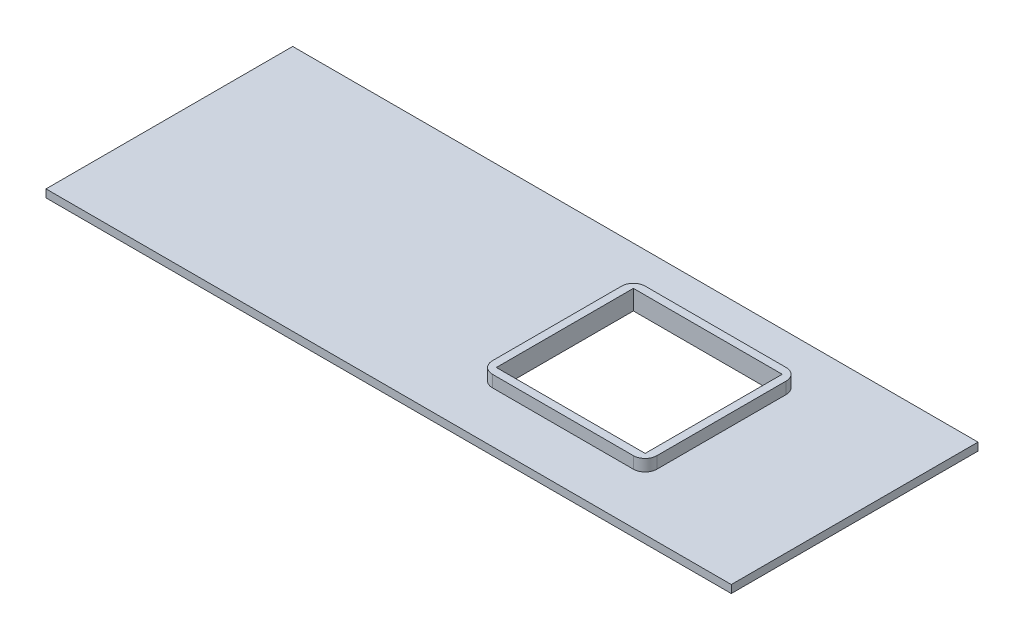
ISO-10303-21;
HEADER;
FILE_DESCRIPTION(('STEP AP214'),'2;1');
FILE_NAME('part.step','',(''),(''),'','','');
FILE_SCHEMA(('AUTOMOTIVE_DESIGN { 1 0 10303 214 1 1 1 1 }'));
ENDSEC;
DATA;
#1=APPLICATION_CONTEXT('core data for automotive mechanical design processes');
#2=APPLICATION_PROTOCOL_DEFINITION('international standard','automotive_design',2000,#1);
#3=PRODUCT_CONTEXT('',#1,'mechanical');
#4=PRODUCT('Part','Part','',(#3));
#5=PRODUCT_RELATED_PRODUCT_CATEGORY('part','',(#4));
#6=PRODUCT_DEFINITION_FORMATION('','',#4);
#7=PRODUCT_DEFINITION_CONTEXT('part definition',#1,'design');
#8=PRODUCT_DEFINITION('design','',#6,#7);
#9=PRODUCT_DEFINITION_SHAPE('','',#8);
#10=(LENGTH_UNIT() NAMED_UNIT(*) SI_UNIT(.MILLI.,.METRE.));
#11=(NAMED_UNIT(*) PLANE_ANGLE_UNIT() SI_UNIT($,.RADIAN.));
#12=(NAMED_UNIT(*) SI_UNIT($,.STERADIAN.) SOLID_ANGLE_UNIT());
#13=UNCERTAINTY_MEASURE_WITH_UNIT(LENGTH_MEASURE(1.E-05),#10,'distance_accuracy_value','');
#14=(GEOMETRIC_REPRESENTATION_CONTEXT(3) GLOBAL_UNCERTAINTY_ASSIGNED_CONTEXT((#13)) GLOBAL_UNIT_ASSIGNED_CONTEXT((#10,
#11,#12)) REPRESENTATION_CONTEXT('',''));
#15=CARTESIAN_POINT('',(0.,0.,0.));
#16=DIRECTION('',(0.,0.,1.));
#17=DIRECTION('',(1.,0.,0.));
#18=AXIS2_PLACEMENT_3D('',#15,#16,#17);
#19=CARTESIAN_POINT('',(0.,3.,0.));
#20=DIRECTION('',(0.,1.,0.));
#21=DIRECTION('',(0.,0.,1.));
#22=AXIS2_PLACEMENT_3D('',#19,#20,#21);
#23=PLANE('',#22);
#24=DIRECTION('',(-1.,0.,0.));
#25=VECTOR('',#24,1.);
#26=CARTESIAN_POINT('',(-39.3895207019308,3.,-29.1848180567591));
#27=LINE('',#26,#25);
#28=CARTESIAN_POINT('',(-0.389520701930782,3.,-29.1848180567591));
#29=VERTEX_POINT('',#28);
#30=CARTESIAN_POINT('',(-36.3895207019308,3.,-29.1848180567591));
#31=VERTEX_POINT('',#30);
#32=EDGE_CURVE('E266',#29,#31,#27,.T.);
#33=ORIENTED_EDGE('',*,*,#32,.T.);
#34=CARTESIAN_POINT('',(-36.3895207019308,3.,-26.1848180567591));
#35=DIRECTION('',(0.,1.,0.));
#36=DIRECTION('',(0.,0.,1.));
#37=AXIS2_PLACEMENT_3D('',#34,#35,#36);
#38=CIRCLE('',#37,3.);
#39=CARTESIAN_POINT('',(-39.3895207019308,3.,-26.1848180567591));
#40=VERTEX_POINT('',#39);
#41=EDGE_CURVE('E319',#31,#40,#38,.T.);
#42=ORIENTED_EDGE('',*,*,#41,.T.);
#43=DIRECTION('',(0.,0.,1.));
#44=VECTOR('',#43,1.);
#45=CARTESIAN_POINT('',(-39.3895207019308,3.,-29.1848180567591));
#46=LINE('',#45,#44);
#47=CARTESIAN_POINT('',(-39.3895207019308,3.,6.81518194324093));
#48=VERTEX_POINT('',#47);
#49=EDGE_CURVE('E255',#40,#48,#46,.T.);
#50=ORIENTED_EDGE('',*,*,#49,.T.);
#51=CARTESIAN_POINT('',(-36.3895207019308,3.,6.81518194324093));
#52=DIRECTION('',(0.,1.,0.));
#53=DIRECTION('',(0.,0.,1.));
#54=AXIS2_PLACEMENT_3D('',#51,#52,#53);
#55=CIRCLE('',#54,3.);
#56=CARTESIAN_POINT('',(-36.3895207019308,3.,9.81518194324093));
#57=VERTEX_POINT('',#56);
#58=EDGE_CURVE('E311',#48,#57,#55,.T.);
#59=ORIENTED_EDGE('',*,*,#58,.T.);
#60=DIRECTION('',(1.,0.,0.));
#61=VECTOR('',#60,1.);
#62=CARTESIAN_POINT('',(-39.3895207019308,3.,9.81518194324093));
#63=LINE('',#62,#61);
#64=CARTESIAN_POINT('',(-0.389520701930782,3.,9.81518194324093));
#65=VERTEX_POINT('',#64);
#66=EDGE_CURVE('E259',#57,#65,#63,.T.);
#67=ORIENTED_EDGE('',*,*,#66,.T.);
#68=CARTESIAN_POINT('',(-0.389520701930766,3.,6.81518194324093));
#69=DIRECTION('',(0.,1.,0.));
#70=DIRECTION('',(0.,0.,1.));
#71=AXIS2_PLACEMENT_3D('',#68,#69,#70);
#72=CIRCLE('',#71,3.);
#73=CARTESIAN_POINT('',(2.61047929806923,3.,6.81518194324093));
#74=VERTEX_POINT('',#73);
#75=EDGE_CURVE('E68',#65,#74,#72,.T.);
#76=ORIENTED_EDGE('',*,*,#75,.T.);
#77=DIRECTION('',(0.,0.,-1.));
#78=VECTOR('',#77,1.);
#79=CARTESIAN_POINT('',(2.61047929806923,3.,-29.1848180567591));
#80=LINE('',#79,#78);
#81=CARTESIAN_POINT('',(2.61047929806923,3.,-26.1848180567591));
#82=VERTEX_POINT('',#81);
#83=EDGE_CURVE('E263',#74,#82,#80,.T.);
#84=ORIENTED_EDGE('',*,*,#83,.T.);
#85=CARTESIAN_POINT('',(-0.389520701930768,3.,-26.1848180567591));
#86=DIRECTION('',(0.,1.,0.));
#87=DIRECTION('',(0.,0.,1.));
#88=AXIS2_PLACEMENT_3D('',#85,#86,#87);
#89=CIRCLE('',#88,3.);
#90=EDGE_CURVE('E316',#82,#29,#89,.T.);
#91=ORIENTED_EDGE('',*,*,#90,.T.);
#92=EDGE_LOOP('',(#33,#42,#50,#59,#67,#76,#84,#91));
#93=FACE_BOUND('',#92,.T.);
#94=DIRECTION('',(1.,0.,0.));
#95=VECTOR('',#94,1.);
#96=CARTESIAN_POINT('',(-37.3895207019308,3.,7.81518194324093));
#97=LINE('',#96,#95);
#98=CARTESIAN_POINT('',(-37.3895207019308,3.,7.81518194324093));
#99=VERTEX_POINT('',#98);
#100=CARTESIAN_POINT('',(0.610479298069237,3.,7.81518194324093));
#101=VERTEX_POINT('',#100);
#102=EDGE_CURVE('E238',#99,#101,#97,.T.);
#103=ORIENTED_EDGE('',*,*,#102,.F.);
#104=DIRECTION('',(0.,0.,1.));
#105=VECTOR('',#104,1.);
#106=CARTESIAN_POINT('',(-37.3895207019308,3.,-27.1848180567591));
#107=LINE('',#106,#105);
#108=CARTESIAN_POINT('',(-37.3895207019308,3.,-27.1848180567591));
#109=VERTEX_POINT('',#108);
#110=EDGE_CURVE('E235',#109,#99,#107,.T.);
#111=ORIENTED_EDGE('',*,*,#110,.F.);
#112=DIRECTION('',(-1.,0.,0.));
#113=VECTOR('',#112,1.);
#114=CARTESIAN_POINT('',(-37.3895207019308,3.,-27.1848180567591));
#115=LINE('',#114,#113);
#116=CARTESIAN_POINT('',(0.610479298069233,3.,-27.1848180567591));
#117=VERTEX_POINT('',#116);
#118=EDGE_CURVE('E166',#117,#109,#115,.T.);
#119=ORIENTED_EDGE('',*,*,#118,.F.);
#120=DIRECTION('',(0.,0.,-1.));
#121=VECTOR('',#120,1.);
#122=CARTESIAN_POINT('',(0.610479298069233,3.,-27.1848180567591));
#123=LINE('',#122,#121);
#124=EDGE_CURVE('E241',#101,#117,#123,.T.);
#125=ORIENTED_EDGE('',*,*,#124,.F.);
#126=EDGE_LOOP('',(#103,#111,#119,#125));
#127=FACE_BOUND('',#126,.T.);
#128=ADVANCED_FACE('F45',(#93,#127),#23,.T.);
#129=CARTESIAN_POINT('',(-39.3895207019308,3.,-29.1848180567591));
#130=DIRECTION('',(1.,0.,0.));
#131=DIRECTION('',(0.,0.,-1.));
#132=AXIS2_PLACEMENT_3D('',#129,#130,#131);
#133=PLANE('',#132);
#134=ORIENTED_EDGE('',*,*,#49,.F.);
#135=DIRECTION('',(0.,-1.,0.));
#136=VECTOR('',#135,1.);
#137=CARTESIAN_POINT('',(-39.3895207019308,3.,-26.1848180567591));
#138=LINE('',#137,#136);
#139=CARTESIAN_POINT('',(-39.3895207019308,0.,-26.1848180567591));
#140=VERTEX_POINT('',#139);
#141=EDGE_CURVE('E284',#40,#140,#138,.T.);
#142=ORIENTED_EDGE('',*,*,#141,.T.);
#143=DIRECTION('',(0.,0.,1.));
#144=VECTOR('',#143,1.);
#145=CARTESIAN_POINT('',(-39.3895207019308,0.,-29.1848180567591));
#146=LINE('',#145,#144);
#147=CARTESIAN_POINT('',(-39.3895207019308,0.,6.81518194324093));
#148=VERTEX_POINT('',#147);
#149=EDGE_CURVE('E254',#140,#148,#146,.T.);
#150=ORIENTED_EDGE('',*,*,#149,.T.);
#151=DIRECTION('',(0.,-1.,0.));
#152=VECTOR('',#151,1.);
#153=CARTESIAN_POINT('',(-39.3895207019308,3.,6.81518194324093));
#154=LINE('',#153,#152);
#155=EDGE_CURVE('E270',#148,#48,#154,.F.);
#156=ORIENTED_EDGE('',*,*,#155,.T.);
#157=EDGE_LOOP('',(#134,#142,#150,#156));
#158=FACE_BOUND('',#157,.T.);
#159=ADVANCED_FACE('F361',(#158),#133,.F.);
#160=CARTESIAN_POINT('',(-39.3895207019308,3.,9.81518194324093));
#161=DIRECTION('',(0.,0.,-1.));
#162=DIRECTION('',(-1.,0.,0.));
#163=AXIS2_PLACEMENT_3D('',#160,#161,#162);
#164=PLANE('',#163);
#165=DIRECTION('',(1.,0.,0.));
#166=VECTOR('',#165,1.);
#167=CARTESIAN_POINT('',(-39.3895207019308,0.,9.81518194324093));
#168=LINE('',#167,#166);
#169=CARTESIAN_POINT('',(-36.3895207019308,0.,9.81518194324093));
#170=VERTEX_POINT('',#169);
#171=CARTESIAN_POINT('',(-0.389520701930782,0.,9.81518194324093));
#172=VERTEX_POINT('',#171);
#173=EDGE_CURVE('E274',#170,#172,#168,.T.);
#174=ORIENTED_EDGE('',*,*,#173,.T.);
#175=DIRECTION('',(0.,-1.,0.));
#176=VECTOR('',#175,1.);
#177=CARTESIAN_POINT('',(-0.389520701930768,3.,9.81518194324093));
#178=LINE('',#177,#176);
#179=EDGE_CURVE('E11',#172,#65,#178,.F.);
#180=ORIENTED_EDGE('',*,*,#179,.T.);
#181=ORIENTED_EDGE('',*,*,#66,.F.);
#182=DIRECTION('',(0.,-1.,0.));
#183=VECTOR('',#182,1.);
#184=CARTESIAN_POINT('',(-36.3895207019308,3.,9.81518194324093));
#185=LINE('',#184,#183);
#186=EDGE_CURVE('E54',#57,#170,#185,.T.);
#187=ORIENTED_EDGE('',*,*,#186,.T.);
#188=EDGE_LOOP('',(#174,#180,#181,#187));
#189=FACE_BOUND('',#188,.T.);
#190=ADVANCED_FACE('F333',(#189),#164,.F.);
#191=CARTESIAN_POINT('',(2.61047929806923,3.,-29.1848180567591));
#192=DIRECTION('',(-1.,0.,0.));
#193=DIRECTION('',(0.,0.,1.));
#194=AXIS2_PLACEMENT_3D('',#191,#192,#193);
#195=PLANE('',#194);
#196=DIRECTION('',(0.,0.,-1.));
#197=VECTOR('',#196,1.);
#198=CARTESIAN_POINT('',(2.61047929806923,0.,-29.1848180567591));
#199=LINE('',#198,#197);
#200=CARTESIAN_POINT('',(2.61047929806923,0.,6.81518194324093));
#201=VERTEX_POINT('',#200);
#202=CARTESIAN_POINT('',(2.61047929806923,0.,-26.1848180567591));
#203=VERTEX_POINT('',#202);
#204=EDGE_CURVE('E277',#201,#203,#199,.T.);
#205=ORIENTED_EDGE('',*,*,#204,.T.);
#206=DIRECTION('',(0.,-1.,0.));
#207=VECTOR('',#206,1.);
#208=CARTESIAN_POINT('',(2.61047929806923,3.,-26.1848180567591));
#209=LINE('',#208,#207);
#210=EDGE_CURVE('E61',#203,#82,#209,.F.);
#211=ORIENTED_EDGE('',*,*,#210,.T.);
#212=ORIENTED_EDGE('',*,*,#83,.F.);
#213=DIRECTION('',(0.,-1.,0.));
#214=VECTOR('',#213,1.);
#215=CARTESIAN_POINT('',(2.61047929806923,3.,6.81518194324093));
#216=LINE('',#215,#214);
#217=EDGE_CURVE('E322',#74,#201,#216,.T.);
#218=ORIENTED_EDGE('',*,*,#217,.T.);
#219=EDGE_LOOP('',(#205,#211,#212,#218));
#220=FACE_BOUND('',#219,.T.);
#221=ADVANCED_FACE('F344',(#220),#195,.F.);
#222=CARTESIAN_POINT('',(-39.3895207019308,3.,-29.1848180567591));
#223=DIRECTION('',(0.,0.,1.));
#224=DIRECTION('',(1.,0.,0.));
#225=AXIS2_PLACEMENT_3D('',#222,#223,#224);
#226=PLANE('',#225);
#227=DIRECTION('',(-1.,0.,0.));
#228=VECTOR('',#227,1.);
#229=CARTESIAN_POINT('',(-39.3895207019308,0.,-29.1848180567591));
#230=LINE('',#229,#228);
#231=CARTESIAN_POINT('',(-0.389520701930782,0.,-29.1848180567591));
#232=VERTEX_POINT('',#231);
#233=CARTESIAN_POINT('',(-36.3895207019308,0.,-29.1848180567591));
#234=VERTEX_POINT('',#233);
#235=EDGE_CURVE('E260',#232,#234,#230,.T.);
#236=ORIENTED_EDGE('',*,*,#235,.T.);
#237=DIRECTION('',(0.,-1.,0.));
#238=VECTOR('',#237,1.);
#239=CARTESIAN_POINT('',(-36.3895207019308,3.,-29.1848180567591));
#240=LINE('',#239,#238);
#241=EDGE_CURVE('E308',#234,#31,#240,.F.);
#242=ORIENTED_EDGE('',*,*,#241,.T.);
#243=ORIENTED_EDGE('',*,*,#32,.F.);
#244=DIRECTION('',(0.,-1.,0.));
#245=VECTOR('',#244,1.);
#246=CARTESIAN_POINT('',(-0.389520701930768,3.,-29.1848180567591));
#247=LINE('',#246,#245);
#248=EDGE_CURVE('E304',#29,#232,#247,.T.);
#249=ORIENTED_EDGE('',*,*,#248,.T.);
#250=EDGE_LOOP('',(#236,#242,#243,#249));
#251=FACE_BOUND('',#250,.T.);
#252=ADVANCED_FACE('F353',(#251),#226,.F.);
#253=CARTESIAN_POINT('',(-37.3895207019308,3.,-27.1848180567591));
#254=DIRECTION('',(1.,0.,0.));
#255=DIRECTION('',(0.,0.,-1.));
#256=AXIS2_PLACEMENT_3D('',#253,#254,#255);
#257=PLANE('',#256);
#258=DIRECTION('',(0.,-1.,0.));
#259=VECTOR('',#258,1.);
#260=CARTESIAN_POINT('',(-37.3895207019308,3.,7.81518194324093));
#261=LINE('',#260,#259);
#262=CARTESIAN_POINT('',(-37.3895207019308,-2.,7.81518194324093));
#263=VERTEX_POINT('',#262);
#264=EDGE_CURVE('E176',#99,#263,#261,.T.);
#265=ORIENTED_EDGE('',*,*,#264,.T.);
#266=DIRECTION('',(0.,0.,-1.));
#267=VECTOR('',#266,1.);
#268=CARTESIAN_POINT('',(-37.3895207019308,-2.,7.81518194324093));
#269=LINE('',#268,#267);
#270=CARTESIAN_POINT('',(-37.3895207019308,-2.,-27.1848180567591));
#271=VERTEX_POINT('',#270);
#272=EDGE_CURVE('E173',#263,#271,#269,.T.);
#273=ORIENTED_EDGE('',*,*,#272,.T.);
#274=DIRECTION('',(0.,-1.,0.));
#275=VECTOR('',#274,1.);
#276=CARTESIAN_POINT('',(-37.3895207019308,3.,-27.1848180567591));
#277=LINE('',#276,#275);
#278=EDGE_CURVE('E159',#109,#271,#277,.T.);
#279=ORIENTED_EDGE('',*,*,#278,.F.);
#280=ORIENTED_EDGE('',*,*,#110,.T.);
#281=EDGE_LOOP('',(#265,#273,#279,#280));
#282=FACE_BOUND('',#281,.T.);
#283=ADVANCED_FACE('F174',(#282),#257,.T.);
#284=CARTESIAN_POINT('',(-37.3895207019308,3.,7.81518194324093));
#285=DIRECTION('',(0.,0.,-1.));
#286=DIRECTION('',(-1.,0.,0.));
#287=AXIS2_PLACEMENT_3D('',#284,#285,#286);
#288=PLANE('',#287);
#289=DIRECTION('',(0.,-1.,0.));
#290=VECTOR('',#289,1.);
#291=CARTESIAN_POINT('',(0.610479298069237,3.,7.81518194324093));
#292=LINE('',#291,#290);
#293=CARTESIAN_POINT('',(0.610479298069233,-2.,7.81518194324093));
#294=VERTEX_POINT('',#293);
#295=EDGE_CURVE('E249',#101,#294,#292,.T.);
#296=ORIENTED_EDGE('',*,*,#295,.T.);
#297=DIRECTION('',(-1.,0.,0.));
#298=VECTOR('',#297,1.);
#299=CARTESIAN_POINT('',(-37.3895207019308,-2.,7.81518194324093));
#300=LINE('',#299,#298);
#301=EDGE_CURVE('E188',#294,#263,#300,.T.);
#302=ORIENTED_EDGE('',*,*,#301,.T.);
#303=ORIENTED_EDGE('',*,*,#264,.F.);
#304=ORIENTED_EDGE('',*,*,#102,.T.);
#305=EDGE_LOOP('',(#296,#302,#303,#304));
#306=FACE_BOUND('',#305,.T.);
#307=ADVANCED_FACE('F412',(#306),#288,.T.);
#308=CARTESIAN_POINT('',(0.610479298069233,3.,-27.1848180567591));
#309=DIRECTION('',(-1.,0.,0.));
#310=DIRECTION('',(0.,0.,1.));
#311=AXIS2_PLACEMENT_3D('',#308,#309,#310);
#312=PLANE('',#311);
#313=DIRECTION('',(0.,-1.,0.));
#314=VECTOR('',#313,1.);
#315=CARTESIAN_POINT('',(0.610479298069233,3.,-27.1848180567591));
#316=LINE('',#315,#314);
#317=CARTESIAN_POINT('',(0.610479298069233,-2.,-27.1848180567591));
#318=VERTEX_POINT('',#317);
#319=EDGE_CURVE('E170',#117,#318,#316,.T.);
#320=ORIENTED_EDGE('',*,*,#319,.T.);
#321=DIRECTION('',(0.,0.,1.));
#322=VECTOR('',#321,1.);
#323=CARTESIAN_POINT('',(0.610479298069233,-2.,7.81518194324093));
#324=LINE('',#323,#322);
#325=EDGE_CURVE('E184',#318,#294,#324,.T.);
#326=ORIENTED_EDGE('',*,*,#325,.T.);
#327=ORIENTED_EDGE('',*,*,#295,.F.);
#328=ORIENTED_EDGE('',*,*,#124,.T.);
#329=EDGE_LOOP('',(#320,#326,#327,#328));
#330=FACE_BOUND('',#329,.T.);
#331=ADVANCED_FACE('F423',(#330),#312,.T.);
#332=CARTESIAN_POINT('',(-37.3895207019308,3.,-27.1848180567591));
#333=DIRECTION('',(0.,0.,1.));
#334=DIRECTION('',(1.,0.,0.));
#335=AXIS2_PLACEMENT_3D('',#332,#333,#334);
#336=PLANE('',#335);
#337=ORIENTED_EDGE('',*,*,#278,.T.);
#338=DIRECTION('',(1.,0.,0.));
#339=VECTOR('',#338,1.);
#340=CARTESIAN_POINT('',(-37.3895207019308,-2.,-27.1848180567591));
#341=LINE('',#340,#339);
#342=EDGE_CURVE('E163',#271,#318,#341,.T.);
#343=ORIENTED_EDGE('',*,*,#342,.T.);
#344=ORIENTED_EDGE('',*,*,#319,.F.);
#345=ORIENTED_EDGE('',*,*,#118,.T.);
#346=EDGE_LOOP('',(#337,#343,#344,#345));
#347=FACE_BOUND('',#346,.T.);
#348=ADVANCED_FACE('F161',(#347),#336,.T.);
#349=CARTESIAN_POINT('',(-36.3895207019308,3.,-26.1848180567591));
#350=DIRECTION('',(0.,-1.,0.));
#351=DIRECTION('',(0.,0.,-1.));
#352=AXIS2_PLACEMENT_3D('',#349,#350,#351);
#353=CYLINDRICAL_SURFACE('',#352,3.);
#354=ORIENTED_EDGE('',*,*,#41,.F.);
#355=ORIENTED_EDGE('',*,*,#241,.F.);
#356=CARTESIAN_POINT('',(-36.3895207019308,0.,-26.1848180567591));
#357=DIRECTION('',(0.,1.,0.));
#358=DIRECTION('',(0.,0.,1.));
#359=AXIS2_PLACEMENT_3D('',#356,#357,#358);
#360=CIRCLE('',#359,3.);
#361=EDGE_CURVE('E300',#140,#234,#360,.F.);
#362=ORIENTED_EDGE('',*,*,#361,.F.);
#363=ORIENTED_EDGE('',*,*,#141,.F.);
#364=EDGE_LOOP('',(#354,#355,#362,#363));
#365=FACE_BOUND('',#364,.T.);
#366=ADVANCED_FACE('F358',(#365),#353,.T.);
#367=CARTESIAN_POINT('',(-0.389520701930768,3.,-26.1848180567591));
#368=DIRECTION('',(0.,-1.,0.));
#369=DIRECTION('',(0.,0.,-1.));
#370=AXIS2_PLACEMENT_3D('',#367,#368,#369);
#371=CYLINDRICAL_SURFACE('',#370,3.);
#372=ORIENTED_EDGE('',*,*,#90,.F.);
#373=ORIENTED_EDGE('',*,*,#210,.F.);
#374=CARTESIAN_POINT('',(-0.389520701930768,0.,-26.1848180567591));
#375=DIRECTION('',(0.,1.,0.));
#376=DIRECTION('',(0.,0.,1.));
#377=AXIS2_PLACEMENT_3D('',#374,#375,#376);
#378=CIRCLE('',#377,3.);
#379=EDGE_CURVE('E296',#232,#203,#378,.F.);
#380=ORIENTED_EDGE('',*,*,#379,.F.);
#381=ORIENTED_EDGE('',*,*,#248,.F.);
#382=EDGE_LOOP('',(#372,#373,#380,#381));
#383=FACE_BOUND('',#382,.T.);
#384=ADVANCED_FACE('F350',(#383),#371,.T.);
#385=CARTESIAN_POINT('',(-0.389520701930766,3.,6.81518194324093));
#386=DIRECTION('',(0.,-1.,0.));
#387=DIRECTION('',(0.,0.,-1.));
#388=AXIS2_PLACEMENT_3D('',#385,#386,#387);
#389=CYLINDRICAL_SURFACE('',#388,3.);
#390=ORIENTED_EDGE('',*,*,#75,.F.);
#391=ORIENTED_EDGE('',*,*,#179,.F.);
#392=CARTESIAN_POINT('',(-0.389520701930766,0.,6.81518194324093));
#393=DIRECTION('',(0.,1.,0.));
#394=DIRECTION('',(0.,0.,1.));
#395=AXIS2_PLACEMENT_3D('',#392,#393,#394);
#396=CIRCLE('',#395,3.);
#397=EDGE_CURVE('E292',#201,#172,#396,.F.);
#398=ORIENTED_EDGE('',*,*,#397,.F.);
#399=ORIENTED_EDGE('',*,*,#217,.F.);
#400=EDGE_LOOP('',(#390,#391,#398,#399));
#401=FACE_BOUND('',#400,.T.);
#402=ADVANCED_FACE('F343',(#401),#389,.T.);
#403=CARTESIAN_POINT('',(-36.3895207019308,3.,6.81518194324093));
#404=DIRECTION('',(0.,-1.,0.));
#405=DIRECTION('',(0.,0.,-1.));
#406=AXIS2_PLACEMENT_3D('',#403,#404,#405);
#407=CYLINDRICAL_SURFACE('',#406,3.);
#408=ORIENTED_EDGE('',*,*,#58,.F.);
#409=ORIENTED_EDGE('',*,*,#155,.F.);
#410=CARTESIAN_POINT('',(-36.3895207019308,0.,6.81518194324093));
#411=DIRECTION('',(0.,1.,0.));
#412=DIRECTION('',(0.,0.,1.));
#413=AXIS2_PLACEMENT_3D('',#410,#411,#412);
#414=CIRCLE('',#413,3.);
#415=EDGE_CURVE('E288',#170,#148,#414,.F.);
#416=ORIENTED_EDGE('',*,*,#415,.F.);
#417=ORIENTED_EDGE('',*,*,#186,.F.);
#418=EDGE_LOOP('',(#408,#409,#416,#417));
#419=FACE_BOUND('',#418,.T.);
#420=ADVANCED_FACE('F47',(#419),#407,.T.);
#421=CARTESIAN_POINT('',(0.,0.,0.));
#422=DIRECTION('',(0.,-1.,0.));
#423=DIRECTION('',(0.,0.,-1.));
#424=AXIS2_PLACEMENT_3D('',#421,#422,#423);
#425=PLANE('',#424);
#426=DIRECTION('',(0.,0.,-1.));
#427=VECTOR('',#426,1.);
#428=CARTESIAN_POINT('',(-137.389520701931,0.,22.8151819432409));
#429=LINE('',#428,#427);
#430=CARTESIAN_POINT('',(-137.389520701931,0.,22.8151819432409));
#431=VERTEX_POINT('',#430);
#432=CARTESIAN_POINT('',(-137.389520701931,0.,-40.1848180567591));
#433=VERTEX_POINT('',#432);
#434=EDGE_CURVE('E193',#431,#433,#429,.T.);
#435=ORIENTED_EDGE('',*,*,#434,.F.);
#436=DIRECTION('',(-1.,0.,0.));
#437=VECTOR('',#436,1.);
#438=CARTESIAN_POINT('',(-137.389520701931,0.,22.8151819432409));
#439=LINE('',#438,#437);
#440=CARTESIAN_POINT('',(37.6104792980692,0.,22.8151819432409));
#441=VERTEX_POINT('',#440);
#442=EDGE_CURVE('E199',#441,#431,#439,.T.);
#443=ORIENTED_EDGE('',*,*,#442,.F.);
#444=DIRECTION('',(0.,0.,1.));
#445=VECTOR('',#444,1.);
#446=CARTESIAN_POINT('',(37.6104792980692,0.,22.8151819432409));
#447=LINE('',#446,#445);
#448=CARTESIAN_POINT('',(37.6104792980692,0.,-40.1848180567591));
#449=VERTEX_POINT('',#448);
#450=EDGE_CURVE('E215',#449,#441,#447,.T.);
#451=ORIENTED_EDGE('',*,*,#450,.F.);
#452=DIRECTION('',(1.,0.,0.));
#453=VECTOR('',#452,1.);
#454=CARTESIAN_POINT('',(-137.389520701931,0.,-40.1848180567591));
#455=LINE('',#454,#453);
#456=EDGE_CURVE('E212',#433,#449,#455,.T.);
#457=ORIENTED_EDGE('',*,*,#456,.F.);
#458=EDGE_LOOP('',(#435,#443,#451,#457));
#459=FACE_BOUND('',#458,.T.);
#460=ORIENTED_EDGE('',*,*,#149,.F.);
#461=ORIENTED_EDGE('',*,*,#361,.T.);
#462=ORIENTED_EDGE('',*,*,#235,.F.);
#463=ORIENTED_EDGE('',*,*,#379,.T.);
#464=ORIENTED_EDGE('',*,*,#204,.F.);
#465=ORIENTED_EDGE('',*,*,#397,.T.);
#466=ORIENTED_EDGE('',*,*,#173,.F.);
#467=ORIENTED_EDGE('',*,*,#415,.T.);
#468=EDGE_LOOP('',(#460,#461,#462,#463,#464,#465,#466,#467));
#469=FACE_BOUND('',#468,.T.);
#470=ADVANCED_FACE('F339',(#459,#469),#425,.F.);
#471=CARTESIAN_POINT('',(0.,-2.,0.));
#472=DIRECTION('',(0.,-1.,0.));
#473=DIRECTION('',(0.,0.,-1.));
#474=AXIS2_PLACEMENT_3D('',#471,#472,#473);
#475=PLANE('',#474);
#476=DIRECTION('',(0.,0.,-1.));
#477=VECTOR('',#476,1.);
#478=CARTESIAN_POINT('',(-137.389520701931,-2.,22.8151819432409));
#479=LINE('',#478,#477);
#480=CARTESIAN_POINT('',(-137.389520701931,-2.,22.8151819432409));
#481=VERTEX_POINT('',#480);
#482=CARTESIAN_POINT('',(-137.389520701931,-2.,-40.1848180567591));
#483=VERTEX_POINT('',#482);
#484=EDGE_CURVE('E194',#481,#483,#479,.T.);
#485=ORIENTED_EDGE('',*,*,#484,.T.);
#486=DIRECTION('',(1.,0.,0.));
#487=VECTOR('',#486,1.);
#488=CARTESIAN_POINT('',(-137.389520701931,-2.,-40.1848180567591));
#489=LINE('',#488,#487);
#490=CARTESIAN_POINT('',(37.6104792980692,-2.,-40.1848180567591));
#491=VERTEX_POINT('',#490);
#492=EDGE_CURVE('E198',#483,#491,#489,.T.);
#493=ORIENTED_EDGE('',*,*,#492,.T.);
#494=DIRECTION('',(0.,0.,1.));
#495=VECTOR('',#494,1.);
#496=CARTESIAN_POINT('',(37.6104792980692,-2.,22.8151819432409));
#497=LINE('',#496,#495);
#498=CARTESIAN_POINT('',(37.6104792980692,-2.,22.8151819432409));
#499=VERTEX_POINT('',#498);
#500=EDGE_CURVE('E202',#491,#499,#497,.T.);
#501=ORIENTED_EDGE('',*,*,#500,.T.);
#502=DIRECTION('',(-1.,0.,0.));
#503=VECTOR('',#502,1.);
#504=CARTESIAN_POINT('',(-137.389520701931,-2.,22.8151819432409));
#505=LINE('',#504,#503);
#506=EDGE_CURVE('E205',#499,#481,#505,.T.);
#507=ORIENTED_EDGE('',*,*,#506,.T.);
#508=EDGE_LOOP('',(#485,#493,#501,#507));
#509=FACE_BOUND('',#508,.T.);
#510=ORIENTED_EDGE('',*,*,#342,.F.);
#511=ORIENTED_EDGE('',*,*,#272,.F.);
#512=ORIENTED_EDGE('',*,*,#301,.F.);
#513=ORIENTED_EDGE('',*,*,#325,.F.);
#514=EDGE_LOOP('',(#510,#511,#512,#513));
#515=FACE_BOUND('',#514,.T.);
#516=ADVANCED_FACE('F182',(#509,#515),#475,.T.);
#517=CARTESIAN_POINT('',(-137.389520701931,-2.,22.8151819432409));
#518=DIRECTION('',(1.,0.,0.));
#519=DIRECTION('',(0.,0.,-1.));
#520=AXIS2_PLACEMENT_3D('',#517,#518,#519);
#521=PLANE('',#520);
#522=ORIENTED_EDGE('',*,*,#434,.T.);
#523=DIRECTION('',(0.,1.,0.));
#524=VECTOR('',#523,1.);
#525=CARTESIAN_POINT('',(-137.389520701931,-2.,-40.1848180567591));
#526=LINE('',#525,#524);
#527=EDGE_CURVE('E231',#483,#433,#526,.T.);
#528=ORIENTED_EDGE('',*,*,#527,.F.);
#529=ORIENTED_EDGE('',*,*,#484,.F.);
#530=DIRECTION('',(0.,1.,0.));
#531=VECTOR('',#530,1.);
#532=CARTESIAN_POINT('',(-137.389520701931,-2.,22.8151819432409));
#533=LINE('',#532,#531);
#534=EDGE_CURVE('E208',#481,#431,#533,.T.);
#535=ORIENTED_EDGE('',*,*,#534,.T.);
#536=EDGE_LOOP('',(#522,#528,#529,#535));
#537=FACE_BOUND('',#536,.T.);
#538=ADVANCED_FACE('F459',(#537),#521,.F.);
#539=CARTESIAN_POINT('',(-137.389520701931,-2.,-40.1848180567591));
#540=DIRECTION('',(0.,0.,1.));
#541=DIRECTION('',(1.,0.,0.));
#542=AXIS2_PLACEMENT_3D('',#539,#540,#541);
#543=PLANE('',#542);
#544=ORIENTED_EDGE('',*,*,#456,.T.);
#545=DIRECTION('',(0.,1.,0.));
#546=VECTOR('',#545,1.);
#547=CARTESIAN_POINT('',(37.6104792980692,-2.,-40.1848180567591));
#548=LINE('',#547,#546);
#549=EDGE_CURVE('E227',#491,#449,#548,.T.);
#550=ORIENTED_EDGE('',*,*,#549,.F.);
#551=ORIENTED_EDGE('',*,*,#492,.F.);
#552=ORIENTED_EDGE('',*,*,#527,.T.);
#553=EDGE_LOOP('',(#544,#550,#551,#552));
#554=FACE_BOUND('',#553,.T.);
#555=ADVANCED_FACE('F469',(#554),#543,.F.);
#556=CARTESIAN_POINT('',(37.6104792980692,-2.,22.8151819432409));
#557=DIRECTION('',(-1.,0.,0.));
#558=DIRECTION('',(0.,0.,1.));
#559=AXIS2_PLACEMENT_3D('',#556,#557,#558);
#560=PLANE('',#559);
#561=ORIENTED_EDGE('',*,*,#450,.T.);
#562=DIRECTION('',(0.,1.,0.));
#563=VECTOR('',#562,1.);
#564=CARTESIAN_POINT('',(37.6104792980692,-2.,22.8151819432409));
#565=LINE('',#564,#563);
#566=EDGE_CURVE('E223',#499,#441,#565,.T.);
#567=ORIENTED_EDGE('',*,*,#566,.F.);
#568=ORIENTED_EDGE('',*,*,#500,.F.);
#569=ORIENTED_EDGE('',*,*,#549,.T.);
#570=EDGE_LOOP('',(#561,#567,#568,#569));
#571=FACE_BOUND('',#570,.T.);
#572=ADVANCED_FACE('F479',(#571),#560,.F.);
#573=CARTESIAN_POINT('',(-137.389520701931,-2.,22.8151819432409));
#574=DIRECTION('',(0.,0.,-1.));
#575=DIRECTION('',(-1.,0.,0.));
#576=AXIS2_PLACEMENT_3D('',#573,#574,#575);
#577=PLANE('',#576);
#578=ORIENTED_EDGE('',*,*,#442,.T.);
#579=ORIENTED_EDGE('',*,*,#534,.F.);
#580=ORIENTED_EDGE('',*,*,#506,.F.);
#581=ORIENTED_EDGE('',*,*,#566,.T.);
#582=EDGE_LOOP('',(#578,#579,#580,#581));
#583=FACE_BOUND('',#582,.T.);
#584=ADVANCED_FACE('F489',(#583),#577,.F.);
#585=CLOSED_SHELL('',(#128,#159,#190,#221,#252,#283,#307,#331,#348,#366,#384,#402,#420,#470,
#516,#538,#555,#572,#584));
#586=MANIFOLD_SOLID_BREP('B2',#585);
#587=ADVANCED_BREP_SHAPE_REPRESENTATION('',(#18,#586),#14);
#588=SHAPE_DEFINITION_REPRESENTATION(#9,#587);
ENDSEC;
END-ISO-10303-21;
